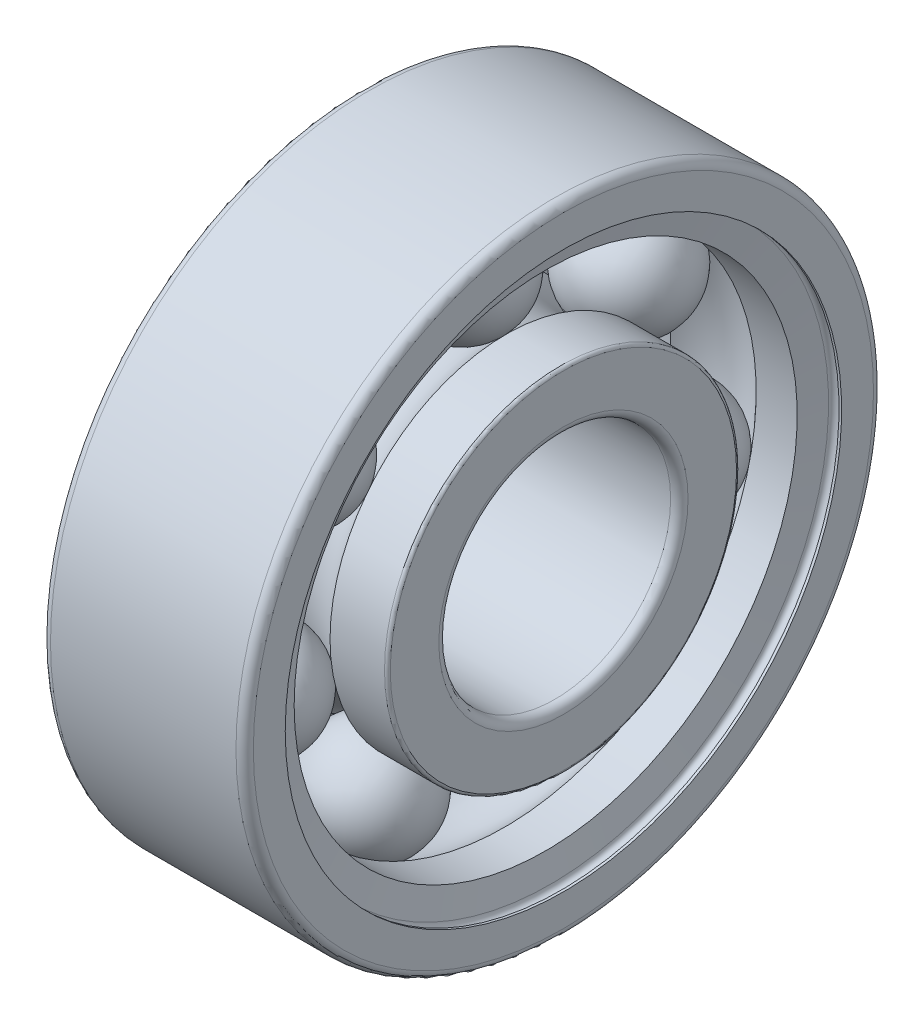
ISO-10303-21;
HEADER;
FILE_DESCRIPTION(('STEP AP214'),'2;1');
FILE_NAME('part.step','',(''),(''),'','','');
FILE_SCHEMA(('AUTOMOTIVE_DESIGN { 1 0 10303 214 1 1 1 1 }'));
ENDSEC;
DATA;
#1=APPLICATION_CONTEXT('core data for automotive mechanical design processes');
#2=APPLICATION_PROTOCOL_DEFINITION('international standard','automotive_design',2000,#1);
#3=PRODUCT_CONTEXT('',#1,'mechanical');
#4=PRODUCT('Part','Part','',(#3));
#5=PRODUCT_RELATED_PRODUCT_CATEGORY('part','',(#4));
#6=PRODUCT_DEFINITION_FORMATION('','',#4);
#7=PRODUCT_DEFINITION_CONTEXT('part definition',#1,'design');
#8=PRODUCT_DEFINITION('design','',#6,#7);
#9=PRODUCT_DEFINITION_SHAPE('','',#8);
#10=(LENGTH_UNIT() NAMED_UNIT(*) SI_UNIT(.MILLI.,.METRE.));
#11=(NAMED_UNIT(*) PLANE_ANGLE_UNIT() SI_UNIT($,.RADIAN.));
#12=(NAMED_UNIT(*) SI_UNIT($,.STERADIAN.) SOLID_ANGLE_UNIT());
#13=UNCERTAINTY_MEASURE_WITH_UNIT(LENGTH_MEASURE(1.E-05),#10,'distance_accuracy_value','');
#14=(GEOMETRIC_REPRESENTATION_CONTEXT(3) GLOBAL_UNCERTAINTY_ASSIGNED_CONTEXT((#13)) GLOBAL_UNIT_ASSIGNED_CONTEXT((#10,
#11,#12)) REPRESENTATION_CONTEXT('',''));
#15=CARTESIAN_POINT('',(0.,0.,0.));
#16=DIRECTION('',(0.,0.,1.));
#17=DIRECTION('',(1.,0.,0.));
#18=AXIS2_PLACEMENT_3D('',#15,#16,#17);
#19=CARTESIAN_POINT('',(3.5,4.58265004366168,5.74646139614003));
#20=DIRECTION('',(-1.,0.,0.));
#21=DIRECTION('',(0.,-0.623489801858731,-0.781831482468032));
#22=AXIS2_PLACEMENT_3D('',#19,#20,#21);
#23=SPHERICAL_SURFACE('',#22,1.9845);
#24=CARTESIAN_POINT('',(1.5155,4.58265004366168,5.74646139614003));
#25=VERTEX_POINT('',#24);
#26=VERTEX_LOOP('',#25);
#27=FACE_BOUND('',#26,.T.);
#28=ADVANCED_FACE('P0_F12',(#27),#23,.T.);
#29=CLOSED_SHELL('',(#28));
#30=MANIFOLD_SOLID_BREP('P0_B1',#29);
#31=CARTESIAN_POINT('',(3.5,-1.63552886457889,7.16572015453641));
#32=DIRECTION('',(-1.,0.,0.));
#33=DIRECTION('',(0.,0.222520933956311,-0.974927912181824));
#34=AXIS2_PLACEMENT_3D('',#31,#32,#33);
#35=SPHERICAL_SURFACE('',#34,1.9845);
#36=CARTESIAN_POINT('',(1.5155,-1.63552886457889,7.16572015453641));
#37=VERTEX_POINT('',#36);
#38=VERTEX_LOOP('',#37);
#39=FACE_BOUND('',#38,.T.);
#40=ADVANCED_FACE('P1_F13',(#39),#35,.T.);
#41=CLOSED_SHELL('',(#40));
#42=MANIFOLD_SOLID_BREP('P1_B1',#41);
#43=CARTESIAN_POINT('',(3.5,-6.62212117908278,3.18904548251406));
#44=DIRECTION('',(-1.,0.,0.));
#45=DIRECTION('',(0.,0.900968867902419,-0.433883739117559));
#46=AXIS2_PLACEMENT_3D('',#43,#44,#45);
#47=SPHERICAL_SURFACE('',#46,1.9845);
#48=CARTESIAN_POINT('',(1.5155,-6.62212117908278,3.18904548251406));
#49=VERTEX_POINT('',#48);
#50=VERTEX_LOOP('',#49);
#51=FACE_BOUND('',#50,.T.);
#52=ADVANCED_FACE('P2_F13',(#51),#47,.T.);
#53=CLOSED_SHELL('',(#52));
#54=MANIFOLD_SOLID_BREP('P2_B1',#53);
#55=CARTESIAN_POINT('',(3.5,-6.62212117908278,-3.18904548251406));
#56=DIRECTION('',(-1.,0.,0.));
#57=DIRECTION('',(0.,0.900968867902419,0.433883739117559));
#58=AXIS2_PLACEMENT_3D('',#55,#56,#57);
#59=SPHERICAL_SURFACE('',#58,1.9845);
#60=CARTESIAN_POINT('',(1.5155,-6.62212117908278,-3.18904548251406));
#61=VERTEX_POINT('',#60);
#62=VERTEX_LOOP('',#61);
#63=FACE_BOUND('',#62,.T.);
#64=ADVANCED_FACE('P3_F13',(#63),#59,.T.);
#65=CLOSED_SHELL('',(#64));
#66=MANIFOLD_SOLID_BREP('P3_B1',#65);
#67=CARTESIAN_POINT('',(3.5,-1.63552886457889,-7.16572015453641));
#68=DIRECTION('',(-1.,0.,0.));
#69=DIRECTION('',(0.,0.222520933956311,0.974927912181824));
#70=AXIS2_PLACEMENT_3D('',#67,#68,#69);
#71=SPHERICAL_SURFACE('',#70,1.9845);
#72=CARTESIAN_POINT('',(1.5155,-1.63552886457889,-7.16572015453641));
#73=VERTEX_POINT('',#72);
#74=VERTEX_LOOP('',#73);
#75=FACE_BOUND('',#74,.T.);
#76=ADVANCED_FACE('P4_F13',(#75),#71,.T.);
#77=CLOSED_SHELL('',(#76));
#78=MANIFOLD_SOLID_BREP('P4_B1',#77);
#79=CARTESIAN_POINT('',(3.5,4.58265004366168,-5.74646139614003));
#80=DIRECTION('',(-1.,0.,0.));
#81=DIRECTION('',(0.,-0.623489801858731,0.781831482468032));
#82=AXIS2_PLACEMENT_3D('',#79,#80,#81);
#83=SPHERICAL_SURFACE('',#82,1.9845);
#84=CARTESIAN_POINT('',(1.5155,4.58265004366168,-5.74646139614003));
#85=VERTEX_POINT('',#84);
#86=VERTEX_LOOP('',#85);
#87=FACE_BOUND('',#86,.T.);
#88=ADVANCED_FACE('P5_F13',(#87),#83,.T.);
#89=CLOSED_SHELL('',(#88));
#90=MANIFOLD_SOLID_BREP('P5_B1',#89);
#91=CARTESIAN_POINT('',(3.5,7.35,0.));
#92=DIRECTION('',(-1.,0.,0.));
#93=DIRECTION('',(0.,-1.,0.));
#94=AXIS2_PLACEMENT_3D('',#91,#92,#93);
#95=SPHERICAL_SURFACE('',#94,1.9845);
#96=CARTESIAN_POINT('',(1.5155,7.35,0.));
#97=VERTEX_POINT('',#96);
#98=VERTEX_LOOP('',#97);
#99=FACE_BOUND('',#98,.T.);
#100=ADVANCED_FACE('P6_F13',(#99),#95,.T.);
#101=CLOSED_SHELL('',(#100));
#102=MANIFOLD_SOLID_BREP('P6_B1',#101);
#103=CARTESIAN_POINT('',(0.,10.7,0.));
#104=DIRECTION('',(1.,0.,0.));
#105=DIRECTION('',(0.,0.,-1.));
#106=AXIS2_PLACEMENT_3D('',#103,#104,#105);
#107=PLANE('',#106);
#108=CARTESIAN_POINT('',(0.,0.,0.));
#109=DIRECTION('',(-1.,0.,0.));
#110=DIRECTION('',(0.,0.,1.));
#111=AXIS2_PLACEMENT_3D('',#108,#109,#110);
#112=CIRCLE('',#111,9.6);
#113=CARTESIAN_POINT('',(0.,0.,9.6));
#114=VERTEX_POINT('',#113);
#115=EDGE_CURVE('P7_E61',#114,#114,#112,.T.);
#116=ORIENTED_EDGE('',*,*,#115,.F.);
#117=EDGE_LOOP('',(#116));
#118=FACE_BOUND('',#117,.T.);
#119=CARTESIAN_POINT('',(0.,0.,0.));
#120=DIRECTION('',(-1.,0.,0.));
#121=DIRECTION('',(0.,0.,1.));
#122=AXIS2_PLACEMENT_3D('',#119,#120,#121);
#123=CIRCLE('',#122,10.7);
#124=CARTESIAN_POINT('',(0.,0.,10.7));
#125=VERTEX_POINT('',#124);
#126=EDGE_CURVE('P7_E10',#125,#125,#123,.T.);
#127=ORIENTED_EDGE('',*,*,#126,.T.);
#128=EDGE_LOOP('',(#127));
#129=FACE_BOUND('',#128,.T.);
#130=ADVANCED_FACE('P7_F15',(#118,#129),#107,.F.);
#131=CARTESIAN_POINT('',(0.299999999999937,0.,0.));
#132=DIRECTION('',(-1.,0.,0.));
#133=DIRECTION('',(0.,0.,1.));
#134=AXIS2_PLACEMENT_3D('',#131,#132,#133);
#135=TOROIDAL_SURFACE('',#134,10.7000000000001,0.299999999999937);
#136=ORIENTED_EDGE('',*,*,#126,.F.);
#137=EDGE_LOOP('',(#136));
#138=FACE_BOUND('',#137,.T.);
#139=CARTESIAN_POINT('',(0.300000000000002,0.,0.));
#140=DIRECTION('',(-1.,0.,0.));
#141=DIRECTION('',(0.,0.,1.));
#142=AXIS2_PLACEMENT_3D('',#139,#140,#141);
#143=CIRCLE('',#142,11.);
#144=CARTESIAN_POINT('',(0.300000000000002,0.,11.));
#145=VERTEX_POINT('',#144);
#146=EDGE_CURVE('P7_E21',#145,#145,#143,.T.);
#147=ORIENTED_EDGE('',*,*,#146,.T.);
#148=EDGE_LOOP('',(#147));
#149=FACE_BOUND('',#148,.T.);
#150=ADVANCED_FACE('P7_F68',(#138,#149),#135,.T.);
#151=CARTESIAN_POINT('',(50.,0.,0.));
#152=DIRECTION('',(-1.,0.,0.));
#153=DIRECTION('',(0.,0.,1.));
#154=AXIS2_PLACEMENT_3D('',#151,#152,#153);
#155=CYLINDRICAL_SURFACE('',#154,11.);
#156=ORIENTED_EDGE('',*,*,#146,.F.);
#157=EDGE_LOOP('',(#156));
#158=FACE_BOUND('',#157,.T.);
#159=CARTESIAN_POINT('',(6.7,0.,0.));
#160=DIRECTION('',(-1.,0.,0.));
#161=DIRECTION('',(0.,0.,1.));
#162=AXIS2_PLACEMENT_3D('',#159,#160,#161);
#163=CIRCLE('',#162,11.);
#164=CARTESIAN_POINT('',(6.7,0.,11.));
#165=VERTEX_POINT('',#164);
#166=EDGE_CURVE('P7_E25',#165,#165,#163,.T.);
#167=ORIENTED_EDGE('',*,*,#166,.T.);
#168=EDGE_LOOP('',(#167));
#169=FACE_BOUND('',#168,.T.);
#170=ADVANCED_FACE('P7_F73',(#158,#169),#155,.T.);
#171=CARTESIAN_POINT('',(6.70000000000012,0.,0.));
#172=DIRECTION('',(-1.,0.,0.));
#173=DIRECTION('',(0.,0.,1.));
#174=AXIS2_PLACEMENT_3D('',#171,#172,#173);
#175=TOROIDAL_SURFACE('',#174,10.7000000000001,0.299999999999876);
#176=ORIENTED_EDGE('',*,*,#166,.F.);
#177=EDGE_LOOP('',(#176));
#178=FACE_BOUND('',#177,.T.);
#179=CARTESIAN_POINT('',(7.,0.,0.));
#180=DIRECTION('',(-1.,0.,0.));
#181=DIRECTION('',(0.,0.,1.));
#182=AXIS2_PLACEMENT_3D('',#179,#180,#181);
#183=CIRCLE('',#182,10.7);
#184=CARTESIAN_POINT('',(7.,0.,10.7));
#185=VERTEX_POINT('',#184);
#186=EDGE_CURVE('P7_E29',#185,#185,#183,.T.);
#187=ORIENTED_EDGE('',*,*,#186,.T.);
#188=EDGE_LOOP('',(#187));
#189=FACE_BOUND('',#188,.T.);
#190=ADVANCED_FACE('P7_F78',(#178,#189),#175,.T.);
#191=CARTESIAN_POINT('',(7.,9.6,0.));
#192=DIRECTION('',(-1.,0.,0.));
#193=DIRECTION('',(0.,0.,1.));
#194=AXIS2_PLACEMENT_3D('',#191,#192,#193);
#195=PLANE('',#194);
#196=ORIENTED_EDGE('',*,*,#186,.F.);
#197=EDGE_LOOP('',(#196));
#198=FACE_BOUND('',#197,.T.);
#199=CARTESIAN_POINT('',(7.,0.,0.));
#200=DIRECTION('',(-1.,0.,0.));
#201=DIRECTION('',(0.,0.,1.));
#202=AXIS2_PLACEMENT_3D('',#199,#200,#201);
#203=CIRCLE('',#202,9.6);
#204=CARTESIAN_POINT('',(7.,0.,9.6));
#205=VERTEX_POINT('',#204);
#206=EDGE_CURVE('P7_E34',#205,#205,#203,.T.);
#207=ORIENTED_EDGE('',*,*,#206,.T.);
#208=EDGE_LOOP('',(#207));
#209=FACE_BOUND('',#208,.T.);
#210=ADVANCED_FACE('P7_F84',(#198,#209),#195,.F.);
#211=CARTESIAN_POINT('',(50.,0.,0.));
#212=DIRECTION('',(-1.,0.,0.));
#213=DIRECTION('',(0.,0.,1.));
#214=AXIS2_PLACEMENT_3D('',#211,#212,#213);
#215=CYLINDRICAL_SURFACE('',#214,9.6);
#216=ORIENTED_EDGE('',*,*,#206,.F.);
#217=EDGE_LOOP('',(#216));
#218=FACE_BOUND('',#217,.T.);
#219=CARTESIAN_POINT('',(6.91,0.,0.));
#220=DIRECTION('',(-1.,0.,0.));
#221=DIRECTION('',(0.,0.,1.));
#222=AXIS2_PLACEMENT_3D('',#219,#220,#221);
#223=CIRCLE('',#222,9.6);
#224=CARTESIAN_POINT('',(6.91,0.,9.6));
#225=VERTEX_POINT('',#224);
#226=EDGE_CURVE('P7_E37',#225,#225,#223,.T.);
#227=ORIENTED_EDGE('',*,*,#226,.T.);
#228=EDGE_LOOP('',(#227));
#229=FACE_BOUND('',#228,.T.);
#230=ADVANCED_FACE('P7_F88',(#218,#229),#215,.F.);
#231=CARTESIAN_POINT('',(6.73,0.,0.));
#232=DIRECTION('',(-1.,0.,0.));
#233=DIRECTION('',(0.,0.,1.));
#234=AXIS2_PLACEMENT_3D('',#231,#232,#233);
#235=TOROIDAL_SURFACE('',#234,9.6000000094977,0.18);
#236=ORIENTED_EDGE('',*,*,#226,.F.);
#237=EDGE_LOOP('',(#236));
#238=FACE_BOUND('',#237,.T.);
#239=CARTESIAN_POINT('',(6.55,0.,0.));
#240=DIRECTION('',(-1.,0.,0.));
#241=DIRECTION('',(0.,0.,1.));
#242=AXIS2_PLACEMENT_3D('',#239,#240,#241);
#243=CIRCLE('',#242,9.6);
#244=CARTESIAN_POINT('',(6.55,0.,9.6));
#245=VERTEX_POINT('',#244);
#246=EDGE_CURVE('P7_E40',#245,#245,#243,.T.);
#247=ORIENTED_EDGE('',*,*,#246,.T.);
#248=EDGE_LOOP('',(#247));
#249=FACE_BOUND('',#248,.T.);
#250=ADVANCED_FACE('P7_F92',(#238,#249),#235,.F.);
#251=CARTESIAN_POINT('',(6.3877791777482,0.,0.));
#252=DIRECTION('',(1.,0.,0.));
#253=DIRECTION('',(0.,0.,-1.));
#254=AXIS2_PLACEMENT_3D('',#251,#252,#253);
#255=CONICAL_SURFACE('',#254,8.68,1.39626340159545);
#256=ORIENTED_EDGE('',*,*,#246,.F.);
#257=EDGE_LOOP('',(#256));
#258=FACE_BOUND('',#257,.T.);
#259=CARTESIAN_POINT('',(6.3877791777482,0.,0.));
#260=DIRECTION('',(-1.,0.,0.));
#261=DIRECTION('',(0.,0.,1.));
#262=AXIS2_PLACEMENT_3D('',#259,#260,#261);
#263=CIRCLE('',#262,8.68);
#264=CARTESIAN_POINT('',(6.3877791777482,0.,8.68));
#265=VERTEX_POINT('',#264);
#266=EDGE_CURVE('P7_E43',#265,#265,#263,.T.);
#267=ORIENTED_EDGE('',*,*,#266,.T.);
#268=EDGE_LOOP('',(#267));
#269=FACE_BOUND('',#268,.T.);
#270=ADVANCED_FACE('P7_F96',(#258,#269),#255,.F.);
#271=CARTESIAN_POINT('',(50.,0.,0.));
#272=DIRECTION('',(-1.,0.,0.));
#273=DIRECTION('',(0.,0.,1.));
#274=AXIS2_PLACEMENT_3D('',#271,#272,#273);
#275=CYLINDRICAL_SURFACE('',#274,8.68);
#276=ORIENTED_EDGE('',*,*,#266,.F.);
#277=EDGE_LOOP('',(#276));
#278=FACE_BOUND('',#277,.T.);
#279=CARTESIAN_POINT('',(4.9728680355008,0.,0.));
#280=DIRECTION('',(-1.,0.,0.));
#281=DIRECTION('',(0.,0.,1.));
#282=AXIS2_PLACEMENT_3D('',#279,#280,#281);
#283=CIRCLE('',#282,8.68);
#284=CARTESIAN_POINT('',(4.9728680355008,0.,8.68));
#285=VERTEX_POINT('',#284);
#286=EDGE_CURVE('P7_E46',#285,#285,#283,.T.);
#287=ORIENTED_EDGE('',*,*,#286,.T.);
#288=EDGE_LOOP('',(#287));
#289=FACE_BOUND('',#288,.T.);
#290=ADVANCED_FACE('P7_F100',(#278,#289),#275,.F.);
#291=CARTESIAN_POINT('',(3.5,0.,0.));
#292=DIRECTION('',(-1.,0.,0.));
#293=DIRECTION('',(0.,0.,1.));
#294=AXIS2_PLACEMENT_3D('',#291,#292,#293);
#295=TOROIDAL_SURFACE('',#294,7.35000000000001,1.98449999999999);
#296=ORIENTED_EDGE('',*,*,#286,.F.);
#297=EDGE_LOOP('',(#296));
#298=FACE_BOUND('',#297,.T.);
#299=CARTESIAN_POINT('',(2.0271319644992,0.,0.));
#300=DIRECTION('',(-1.,0.,0.));
#301=DIRECTION('',(0.,0.,1.));
#302=AXIS2_PLACEMENT_3D('',#299,#300,#301);
#303=CIRCLE('',#302,8.68);
#304=CARTESIAN_POINT('',(2.0271319644992,0.,8.68));
#305=VERTEX_POINT('',#304);
#306=EDGE_CURVE('P7_E49',#305,#305,#303,.T.);
#307=ORIENTED_EDGE('',*,*,#306,.T.);
#308=EDGE_LOOP('',(#307));
#309=FACE_BOUND('',#308,.T.);
#310=ADVANCED_FACE('P7_F104',(#298,#309),#295,.F.);
#311=CARTESIAN_POINT('',(50.,0.,0.));
#312=DIRECTION('',(-1.,0.,0.));
#313=DIRECTION('',(0.,0.,1.));
#314=AXIS2_PLACEMENT_3D('',#311,#312,#313);
#315=CYLINDRICAL_SURFACE('',#314,8.68);
#316=ORIENTED_EDGE('',*,*,#306,.F.);
#317=EDGE_LOOP('',(#316));
#318=FACE_BOUND('',#317,.T.);
#319=CARTESIAN_POINT('',(0.612220822251791,0.,0.));
#320=DIRECTION('',(-1.,0.,0.));
#321=DIRECTION('',(0.,0.,1.));
#322=AXIS2_PLACEMENT_3D('',#319,#320,#321);
#323=CIRCLE('',#322,8.68);
#324=CARTESIAN_POINT('',(0.612220822251791,0.,8.68));
#325=VERTEX_POINT('',#324);
#326=EDGE_CURVE('P7_E52',#325,#325,#323,.T.);
#327=ORIENTED_EDGE('',*,*,#326,.T.);
#328=EDGE_LOOP('',(#327));
#329=FACE_BOUND('',#328,.T.);
#330=ADVANCED_FACE('P7_F108',(#318,#329),#315,.F.);
#331=CARTESIAN_POINT('',(0.449999999999999,0.,0.));
#332=DIRECTION('',(-1.,0.,0.));
#333=DIRECTION('',(0.,0.,1.));
#334=AXIS2_PLACEMENT_3D('',#331,#332,#333);
#335=CONICAL_SURFACE('',#334,9.6,1.39626340159546);
#336=ORIENTED_EDGE('',*,*,#326,.F.);
#337=EDGE_LOOP('',(#336));
#338=FACE_BOUND('',#337,.T.);
#339=CARTESIAN_POINT('',(0.449999999999999,0.,0.));
#340=DIRECTION('',(-1.,0.,0.));
#341=DIRECTION('',(0.,0.,1.));
#342=AXIS2_PLACEMENT_3D('',#339,#340,#341);
#343=CIRCLE('',#342,9.6);
#344=CARTESIAN_POINT('',(0.449999999999999,0.,9.6));
#345=VERTEX_POINT('',#344);
#346=EDGE_CURVE('P7_E55',#345,#345,#343,.T.);
#347=ORIENTED_EDGE('',*,*,#346,.T.);
#348=EDGE_LOOP('',(#347));
#349=FACE_BOUND('',#348,.T.);
#350=ADVANCED_FACE('P7_F112',(#338,#349),#335,.F.);
#351=CARTESIAN_POINT('',(0.27,0.,0.));
#352=DIRECTION('',(-1.,0.,0.));
#353=DIRECTION('',(0.,0.,1.));
#354=AXIS2_PLACEMENT_3D('',#351,#352,#353);
#355=TOROIDAL_SURFACE('',#354,9.6,0.18);
#356=ORIENTED_EDGE('',*,*,#346,.F.);
#357=EDGE_LOOP('',(#356));
#358=FACE_BOUND('',#357,.T.);
#359=CARTESIAN_POINT('',(0.0899999999999998,0.,0.));
#360=DIRECTION('',(-1.,0.,0.));
#361=DIRECTION('',(0.,0.,1.));
#362=AXIS2_PLACEMENT_3D('',#359,#360,#361);
#363=CIRCLE('',#362,9.6);
#364=CARTESIAN_POINT('',(0.0899999999999998,0.,9.6));
#365=VERTEX_POINT('',#364);
#366=EDGE_CURVE('P7_E58',#365,#365,#363,.T.);
#367=ORIENTED_EDGE('',*,*,#366,.T.);
#368=EDGE_LOOP('',(#367));
#369=FACE_BOUND('',#368,.T.);
#370=ADVANCED_FACE('P7_F116',(#358,#369),#355,.F.);
#371=CARTESIAN_POINT('',(50.,0.,0.));
#372=DIRECTION('',(-1.,0.,0.));
#373=DIRECTION('',(0.,0.,1.));
#374=AXIS2_PLACEMENT_3D('',#371,#372,#373);
#375=CYLINDRICAL_SURFACE('',#374,9.6);
#376=ORIENTED_EDGE('',*,*,#366,.F.);
#377=EDGE_LOOP('',(#376));
#378=FACE_BOUND('',#377,.T.);
#379=ORIENTED_EDGE('',*,*,#115,.T.);
#380=EDGE_LOOP('',(#379));
#381=FACE_BOUND('',#380,.T.);
#382=ADVANCED_FACE('P7_F65',(#378,#381),#375,.F.);
#383=CLOSED_SHELL('',(#130,#150,#170,#190,#210,#230,#250,#270,#290,#310,#330,#350,#370,#382));
#384=MANIFOLD_SOLID_BREP('P7_B1',#383);
#385=CARTESIAN_POINT('',(50.,0.,0.));
#386=DIRECTION('',(-1.,0.,0.));
#387=DIRECTION('',(0.,0.,1.));
#388=AXIS2_PLACEMENT_3D('',#385,#386,#387);
#389=CYLINDRICAL_SURFACE('',#388,6.075);
#390=CARTESIAN_POINT('',(0.100000000000003,0.,0.));
#391=DIRECTION('',(-1.,0.,0.));
#392=DIRECTION('',(0.,0.,1.));
#393=AXIS2_PLACEMENT_3D('',#390,#391,#392);
#394=CIRCLE('',#393,6.075);
#395=CARTESIAN_POINT('',(0.100000000000003,0.,6.075));
#396=VERTEX_POINT('',#395);
#397=EDGE_CURVE('P8_E56',#396,#396,#394,.T.);
#398=ORIENTED_EDGE('',*,*,#397,.F.);
#399=EDGE_LOOP('',(#398));
#400=FACE_BOUND('',#399,.T.);
#401=CARTESIAN_POINT('',(0.269999999999999,0.,0.));
#402=DIRECTION('',(1.,0.,0.));
#403=DIRECTION('',(0.,0.,-1.));
#404=AXIS2_PLACEMENT_3D('',#401,#402,#403);
#405=CIRCLE('',#404,6.075);
#406=CARTESIAN_POINT('',(0.269999999999999,0.,-6.075));
#407=VERTEX_POINT('',#406);
#408=EDGE_CURVE('P8_E10',#407,#407,#405,.T.);
#409=ORIENTED_EDGE('',*,*,#408,.F.);
#410=EDGE_LOOP('',(#409));
#411=FACE_BOUND('',#410,.T.);
#412=ADVANCED_FACE('P8_F15',(#400,#411),#389,.T.);
#413=CARTESIAN_POINT('',(1.979271473931,0.,0.));
#414=DIRECTION('',(-1.,0.,0.));
#415=DIRECTION('',(0.,0.,1.));
#416=AXIS2_PLACEMENT_3D('',#413,#414,#415);
#417=CIRCLE('',#416,6.075);
#418=CARTESIAN_POINT('',(1.979271473931,0.,6.075));
#419=VERTEX_POINT('',#418);
#420=EDGE_CURVE('P8_E53',#419,#419,#417,.T.);
#421=ORIENTED_EDGE('',*,*,#420,.T.);
#422=EDGE_LOOP('',(#421));
#423=FACE_BOUND('',#422,.T.);
#424=CARTESIAN_POINT('',(0.359999999999999,0.,0.));
#425=DIRECTION('',(1.,0.,0.));
#426=DIRECTION('',(0.,0.,-1.));
#427=AXIS2_PLACEMENT_3D('',#424,#425,#426);
#428=CIRCLE('',#427,6.075);
#429=CARTESIAN_POINT('',(0.359999999999999,0.,-6.075));
#430=VERTEX_POINT('',#429);
#431=EDGE_CURVE('P8_E22',#430,#430,#428,.F.);
#432=ORIENTED_EDGE('',*,*,#431,.F.);
#433=EDGE_LOOP('',(#432));
#434=FACE_BOUND('',#433,.T.);
#435=ADVANCED_FACE('P8_F103',(#423,#434),#389,.T.);
#436=CARTESIAN_POINT('',(0.0999999999999214,0.,0.));
#437=DIRECTION('',(-1.,0.,0.));
#438=DIRECTION('',(0.,0.,1.));
#439=AXIS2_PLACEMENT_3D('',#436,#437,#438);
#440=TOROIDAL_SURFACE('',#439,5.97500000000008,0.0999999999999213);
#441=CARTESIAN_POINT('',(0.,0.,0.));
#442=DIRECTION('',(-1.,0.,0.));
#443=DIRECTION('',(0.,0.,1.));
#444=AXIS2_PLACEMENT_3D('',#441,#442,#443);
#445=CIRCLE('',#444,5.975);
#446=CARTESIAN_POINT('',(0.,0.,5.975));
#447=VERTEX_POINT('',#446);
#448=EDGE_CURVE('P8_E26',#447,#447,#445,.T.);
#449=ORIENTED_EDGE('',*,*,#448,.F.);
#450=EDGE_LOOP('',(#449));
#451=FACE_BOUND('',#450,.T.);
#452=ORIENTED_EDGE('',*,*,#397,.T.);
#453=EDGE_LOOP('',(#452));
#454=FACE_BOUND('',#453,.T.);
#455=ADVANCED_FACE('P8_F17',(#451,#454),#440,.T.);
#456=CARTESIAN_POINT('',(0.,5.975,0.));
#457=DIRECTION('',(1.,0.,0.));
#458=DIRECTION('',(0.,0.,-1.));
#459=AXIS2_PLACEMENT_3D('',#456,#457,#458);
#460=PLANE('',#459);
#461=CARTESIAN_POINT('',(0.,0.,0.));
#462=DIRECTION('',(-1.,0.,0.));
#463=DIRECTION('',(0.,0.,1.));
#464=AXIS2_PLACEMENT_3D('',#461,#462,#463);
#465=CIRCLE('',#464,4.3);
#466=CARTESIAN_POINT('',(0.,0.,4.3));
#467=VERTEX_POINT('',#466);
#468=EDGE_CURVE('P8_E30',#467,#467,#465,.T.);
#469=ORIENTED_EDGE('',*,*,#468,.F.);
#470=EDGE_LOOP('',(#469));
#471=FACE_BOUND('',#470,.T.);
#472=ORIENTED_EDGE('',*,*,#448,.T.);
#473=EDGE_LOOP('',(#472));
#474=FACE_BOUND('',#473,.T.);
#475=ADVANCED_FACE('P8_F141',(#471,#474),#460,.F.);
#476=CARTESIAN_POINT('',(0.299999999999939,0.,0.));
#477=DIRECTION('',(-1.,0.,0.));
#478=DIRECTION('',(0.,0.,1.));
#479=AXIS2_PLACEMENT_3D('',#476,#477,#478);
#480=TOROIDAL_SURFACE('',#479,4.29999999999994,0.299999999999939);
#481=CARTESIAN_POINT('',(0.300000000000002,0.,0.));
#482=DIRECTION('',(-1.,0.,0.));
#483=DIRECTION('',(0.,0.,1.));
#484=AXIS2_PLACEMENT_3D('',#481,#482,#483);
#485=CIRCLE('',#484,4.);
#486=CARTESIAN_POINT('',(0.300000000000002,0.,4.));
#487=VERTEX_POINT('',#486);
#488=EDGE_CURVE('P8_E35',#487,#487,#485,.T.);
#489=ORIENTED_EDGE('',*,*,#488,.F.);
#490=EDGE_LOOP('',(#489));
#491=FACE_BOUND('',#490,.T.);
#492=ORIENTED_EDGE('',*,*,#468,.T.);
#493=EDGE_LOOP('',(#492));
#494=FACE_BOUND('',#493,.T.);
#495=ADVANCED_FACE('P8_F138',(#491,#494),#480,.T.);
#496=CARTESIAN_POINT('',(50.,0.,0.));
#497=DIRECTION('',(-1.,0.,0.));
#498=DIRECTION('',(0.,0.,1.));
#499=AXIS2_PLACEMENT_3D('',#496,#497,#498);
#500=CYLINDRICAL_SURFACE('',#499,4.);
#501=CARTESIAN_POINT('',(6.7,0.,0.));
#502=DIRECTION('',(-1.,0.,0.));
#503=DIRECTION('',(0.,0.,1.));
#504=AXIS2_PLACEMENT_3D('',#501,#502,#503);
#505=CIRCLE('',#504,4.);
#506=CARTESIAN_POINT('',(6.7,0.,4.));
#507=VERTEX_POINT('',#506);
#508=EDGE_CURVE('P8_E38',#507,#507,#505,.T.);
#509=ORIENTED_EDGE('',*,*,#508,.F.);
#510=EDGE_LOOP('',(#509));
#511=FACE_BOUND('',#510,.T.);
#512=ORIENTED_EDGE('',*,*,#488,.T.);
#513=EDGE_LOOP('',(#512));
#514=FACE_BOUND('',#513,.T.);
#515=ADVANCED_FACE('P8_F134',(#511,#514),#500,.F.);
#516=CARTESIAN_POINT('',(6.70000000000012,0.,0.));
#517=DIRECTION('',(-1.,0.,0.));
#518=DIRECTION('',(0.,0.,1.));
#519=AXIS2_PLACEMENT_3D('',#516,#517,#518);
#520=TOROIDAL_SURFACE('',#519,4.29999999999988,0.299999999999878);
#521=CARTESIAN_POINT('',(7.,0.,0.));
#522=DIRECTION('',(-1.,0.,0.));
#523=DIRECTION('',(0.,0.,1.));
#524=AXIS2_PLACEMENT_3D('',#521,#522,#523);
#525=CIRCLE('',#524,4.29999999999988);
#526=CARTESIAN_POINT('',(7.,0.,4.29999999999988));
#527=VERTEX_POINT('',#526);
#528=EDGE_CURVE('P8_E41',#527,#527,#525,.T.);
#529=ORIENTED_EDGE('',*,*,#528,.F.);
#530=EDGE_LOOP('',(#529));
#531=FACE_BOUND('',#530,.T.);
#532=ORIENTED_EDGE('',*,*,#508,.T.);
#533=EDGE_LOOP('',(#532));
#534=FACE_BOUND('',#533,.T.);
#535=ADVANCED_FACE('P8_F130',(#531,#534),#520,.T.);
#536=CARTESIAN_POINT('',(7.,4.3,0.));
#537=DIRECTION('',(-1.,0.,0.));
#538=DIRECTION('',(0.,0.,1.));
#539=AXIS2_PLACEMENT_3D('',#536,#537,#538);
#540=PLANE('',#539);
#541=CARTESIAN_POINT('',(7.,0.,0.));
#542=DIRECTION('',(-1.,0.,0.));
#543=DIRECTION('',(0.,0.,1.));
#544=AXIS2_PLACEMENT_3D('',#541,#542,#543);
#545=CIRCLE('',#544,5.975);
#546=CARTESIAN_POINT('',(7.,0.,5.975));
#547=VERTEX_POINT('',#546);
#548=EDGE_CURVE('P8_E44',#547,#547,#545,.T.);
#549=ORIENTED_EDGE('',*,*,#548,.F.);
#550=EDGE_LOOP('',(#549));
#551=FACE_BOUND('',#550,.T.);
#552=ORIENTED_EDGE('',*,*,#528,.T.);
#553=EDGE_LOOP('',(#552));
#554=FACE_BOUND('',#553,.T.);
#555=ADVANCED_FACE('P8_F126',(#551,#554),#540,.F.);
#556=CARTESIAN_POINT('',(6.90000000000015,0.,0.));
#557=DIRECTION('',(-1.,0.,0.));
#558=DIRECTION('',(0.,0.,1.));
#559=AXIS2_PLACEMENT_3D('',#556,#557,#558);
#560=TOROIDAL_SURFACE('',#559,5.97500000000016,0.099999999999845);
#561=CARTESIAN_POINT('',(6.9,0.,0.));
#562=DIRECTION('',(-1.,0.,0.));
#563=DIRECTION('',(0.,0.,1.));
#564=AXIS2_PLACEMENT_3D('',#561,#562,#563);
#565=CIRCLE('',#564,6.075);
#566=CARTESIAN_POINT('',(6.9,0.,6.075));
#567=VERTEX_POINT('',#566);
#568=EDGE_CURVE('P8_E47',#567,#567,#565,.T.);
#569=ORIENTED_EDGE('',*,*,#568,.F.);
#570=EDGE_LOOP('',(#569));
#571=FACE_BOUND('',#570,.T.);
#572=ORIENTED_EDGE('',*,*,#548,.T.);
#573=EDGE_LOOP('',(#572));
#574=FACE_BOUND('',#573,.T.);
#575=ADVANCED_FACE('P8_F122',(#571,#574),#560,.T.);
#576=CARTESIAN_POINT('',(50.,0.,0.));
#577=DIRECTION('',(-1.,0.,0.));
#578=DIRECTION('',(0.,0.,1.));
#579=AXIS2_PLACEMENT_3D('',#576,#577,#578);
#580=CYLINDRICAL_SURFACE('',#579,6.075);
#581=CARTESIAN_POINT('',(5.020728526069,0.,0.));
#582=DIRECTION('',(-1.,0.,0.));
#583=DIRECTION('',(0.,0.,1.));
#584=AXIS2_PLACEMENT_3D('',#581,#582,#583);
#585=CIRCLE('',#584,6.075);
#586=CARTESIAN_POINT('',(5.020728526069,0.,6.075));
#587=VERTEX_POINT('',#586);
#588=EDGE_CURVE('P8_E50',#587,#587,#585,.T.);
#589=ORIENTED_EDGE('',*,*,#588,.F.);
#590=EDGE_LOOP('',(#589));
#591=FACE_BOUND('',#590,.T.);
#592=ORIENTED_EDGE('',*,*,#568,.T.);
#593=EDGE_LOOP('',(#592));
#594=FACE_BOUND('',#593,.T.);
#595=ADVANCED_FACE('P8_F118',(#591,#594),#580,.T.);
#596=CARTESIAN_POINT('',(3.5,0.,0.));
#597=DIRECTION('',(-1.,0.,0.));
#598=DIRECTION('',(0.,0.,1.));
#599=AXIS2_PLACEMENT_3D('',#596,#597,#598);
#600=TOROIDAL_SURFACE('',#599,7.35,1.9845);
#601=ORIENTED_EDGE('',*,*,#420,.F.);
#602=EDGE_LOOP('',(#601));
#603=FACE_BOUND('',#602,.T.);
#604=ORIENTED_EDGE('',*,*,#588,.T.);
#605=EDGE_LOOP('',(#604));
#606=FACE_BOUND('',#605,.T.);
#607=ADVANCED_FACE('P8_F115',(#603,#606),#600,.F.);
#608=CARTESIAN_POINT('',(50.,0.,0.));
#609=DIRECTION('',(-1.,0.,0.));
#610=DIRECTION('',(0.,0.,1.));
#611=AXIS2_PLACEMENT_3D('',#608,#609,#610);
#612=CYLINDRICAL_SURFACE('',#611,9.6);
#613=CARTESIAN_POINT('',(0.269999999999999,0.,0.));
#614=DIRECTION('',(-1.,0.,0.));
#615=DIRECTION('',(0.,0.,1.));
#616=AXIS2_PLACEMENT_3D('',#613,#614,#615);
#617=CIRCLE('',#616,9.6);
#618=CARTESIAN_POINT('',(0.269999999999999,0.,9.6));
#619=VERTEX_POINT('',#618);
#620=EDGE_CURVE('P8_E59',#619,#619,#617,.T.);
#621=ORIENTED_EDGE('',*,*,#620,.F.);
#622=EDGE_LOOP('',(#621));
#623=FACE_BOUND('',#622,.T.);
#624=CARTESIAN_POINT('',(0.359999999999999,0.,0.));
#625=DIRECTION('',(-1.,0.,0.));
#626=DIRECTION('',(0.,0.,1.));
#627=AXIS2_PLACEMENT_3D('',#624,#625,#626);
#628=CIRCLE('',#627,9.6);
#629=CARTESIAN_POINT('',(0.359999999999999,0.,9.6));
#630=VERTEX_POINT('',#629);
#631=EDGE_CURVE('P8_E74',#630,#630,#628,.T.);
#632=ORIENTED_EDGE('',*,*,#631,.T.);
#633=EDGE_LOOP('',(#632));
#634=FACE_BOUND('',#633,.T.);
#635=ADVANCED_FACE('P8_F78',(#623,#634),#612,.T.);
#636=CARTESIAN_POINT('',(0.269999999999999,0.,0.));
#637=DIRECTION('',(-1.,0.,0.));
#638=DIRECTION('',(0.,0.,1.));
#639=AXIS2_PLACEMENT_3D('',#636,#637,#638);
#640=CONICAL_SURFACE('',#639,9.6,1.51977681092792);
#641=CARTESIAN_POINT('',(0.315000000000003,0.,0.));
#642=DIRECTION('',(-1.,0.,0.));
#643=DIRECTION('',(0.,0.,1.));
#644=AXIS2_PLACEMENT_3D('',#641,#642,#643);
#645=CIRCLE('',#644,8.71875);
#646=CARTESIAN_POINT('',(0.315000000000003,0.,8.71875));
#647=VERTEX_POINT('',#646);
#648=EDGE_CURVE('P8_E62',#647,#647,#645,.T.);
#649=ORIENTED_EDGE('',*,*,#648,.F.);
#650=EDGE_LOOP('',(#649));
#651=FACE_BOUND('',#650,.T.);
#652=ORIENTED_EDGE('',*,*,#620,.T.);
#653=EDGE_LOOP('',(#652));
#654=FACE_BOUND('',#653,.T.);
#655=ADVANCED_FACE('P8_F205',(#651,#654),#640,.F.);
#656=CARTESIAN_POINT('',(0.315000000000003,0.,0.));
#657=DIRECTION('',(1.,0.,0.));
#658=DIRECTION('',(0.,0.,-1.));
#659=AXIS2_PLACEMENT_3D('',#656,#657,#658);
#660=CONICAL_SURFACE('',#659,8.71875,1.51977681092792);
#661=CARTESIAN_POINT('',(0.269999999999999,0.,0.));
#662=DIRECTION('',(-1.,0.,0.));
#663=DIRECTION('',(0.,0.,1.));
#664=AXIS2_PLACEMENT_3D('',#661,#662,#663);
#665=CIRCLE('',#664,7.8375);
#666=CARTESIAN_POINT('',(0.269999999999999,0.,7.8375));
#667=VERTEX_POINT('',#666);
#668=EDGE_CURVE('P8_E65',#667,#667,#665,.T.);
#669=ORIENTED_EDGE('',*,*,#668,.F.);
#670=EDGE_LOOP('',(#669));
#671=FACE_BOUND('',#670,.T.);
#672=ORIENTED_EDGE('',*,*,#648,.T.);
#673=EDGE_LOOP('',(#672));
#674=FACE_BOUND('',#673,.T.);
#675=ADVANCED_FACE('P8_F100',(#671,#674),#660,.T.);
#676=CARTESIAN_POINT('',(0.27,7.8375,0.));
#677=DIRECTION('',(1.,0.,0.));
#678=DIRECTION('',(0.,0.,-1.));
#679=AXIS2_PLACEMENT_3D('',#676,#677,#678);
#680=PLANE('',#679);
#681=ORIENTED_EDGE('',*,*,#408,.T.);
#682=EDGE_LOOP('',(#681));
#683=FACE_BOUND('',#682,.T.);
#684=ORIENTED_EDGE('',*,*,#668,.T.);
#685=EDGE_LOOP('',(#684));
#686=FACE_BOUND('',#685,.T.);
#687=ADVANCED_FACE('P8_F94',(#683,#686),#680,.F.);
#688=CARTESIAN_POINT('',(0.359999999999999,0.,0.));
#689=DIRECTION('',(1.,0.,0.));
#690=DIRECTION('',(0.,0.,-1.));
#691=AXIS2_PLACEMENT_3D('',#688,#689,#690);
#692=CONICAL_SURFACE('',#691,6.075,1.51977681092793);
#693=CARTESIAN_POINT('',(0.449999999999999,0.,0.));
#694=DIRECTION('',(-1.,0.,0.));
#695=DIRECTION('',(0.,0.,1.));
#696=AXIS2_PLACEMENT_3D('',#693,#694,#695);
#697=CIRCLE('',#696,7.8375);
#698=CARTESIAN_POINT('',(0.449999999999999,0.,7.8375));
#699=VERTEX_POINT('',#698);
#700=EDGE_CURVE('P8_E68',#699,#699,#697,.T.);
#701=ORIENTED_EDGE('',*,*,#700,.F.);
#702=EDGE_LOOP('',(#701));
#703=FACE_BOUND('',#702,.T.);
#704=ORIENTED_EDGE('',*,*,#431,.T.);
#705=EDGE_LOOP('',(#704));
#706=FACE_BOUND('',#705,.T.);
#707=ADVANCED_FACE('P8_F89',(#703,#706),#692,.F.);
#708=CARTESIAN_POINT('',(0.45,7.8375,0.));
#709=DIRECTION('',(-1.,0.,0.));
#710=DIRECTION('',(0.,0.,1.));
#711=AXIS2_PLACEMENT_3D('',#708,#709,#710);
#712=PLANE('',#711);
#713=CARTESIAN_POINT('',(0.449999999999999,0.,0.));
#714=DIRECTION('',(-1.,0.,0.));
#715=DIRECTION('',(0.,0.,1.));
#716=AXIS2_PLACEMENT_3D('',#713,#714,#715);
#717=CIRCLE('',#716,8.71875);
#718=CARTESIAN_POINT('',(0.449999999999999,0.,8.71875));
#719=VERTEX_POINT('',#718);
#720=EDGE_CURVE('P8_E71',#719,#719,#717,.T.);
#721=ORIENTED_EDGE('',*,*,#720,.F.);
#722=EDGE_LOOP('',(#721));
#723=FACE_BOUND('',#722,.T.);
#724=ORIENTED_EDGE('',*,*,#700,.T.);
#725=EDGE_LOOP('',(#724));
#726=FACE_BOUND('',#725,.T.);
#727=ADVANCED_FACE('P8_F83',(#723,#726),#712,.F.);
#728=CARTESIAN_POINT('',(0.449999999999999,0.,0.));
#729=DIRECTION('',(-1.,0.,0.));
#730=DIRECTION('',(0.,0.,1.));
#731=AXIS2_PLACEMENT_3D('',#728,#729,#730);
#732=CONICAL_SURFACE('',#731,8.71875,1.46902152746005);
#733=ORIENTED_EDGE('',*,*,#631,.F.);
#734=EDGE_LOOP('',(#733));
#735=FACE_BOUND('',#734,.T.);
#736=ORIENTED_EDGE('',*,*,#720,.T.);
#737=EDGE_LOOP('',(#736));
#738=FACE_BOUND('',#737,.T.);
#739=ADVANCED_FACE('P8_F80',(#735,#738),#732,.T.);
#740=CLOSED_SHELL('',(#412,#435,#455,#475,#495,#515,#535,#555,#575,#595,#607,#635,#655,#675,
#687,#707,#727,#739));
#741=MANIFOLD_SOLID_BREP('P8_B1',#740);
#742=ADVANCED_BREP_SHAPE_REPRESENTATION('',(#18,#30,#42,#54,#66,#78,#90,#102,#384,#741),#14);
#743=SHAPE_DEFINITION_REPRESENTATION(#9,#742);
ENDSEC;
END-ISO-10303-21;
